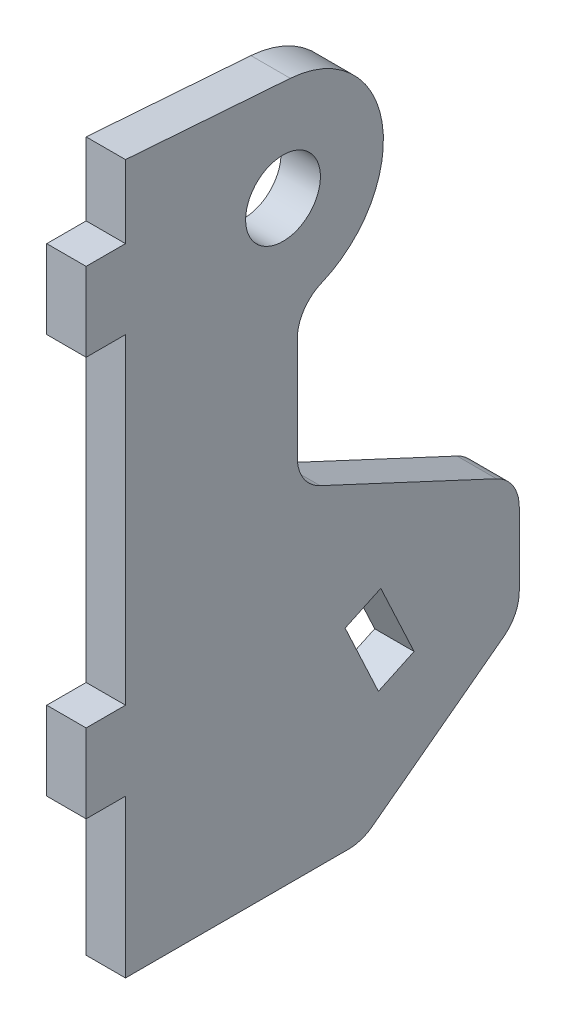
ISO-10303-21;
HEADER;
FILE_DESCRIPTION(('STEP AP214'),'2;1');
FILE_NAME('part.step','',(''),(''),'','','');
FILE_SCHEMA(('AUTOMOTIVE_DESIGN { 1 0 10303 214 1 1 1 1 }'));
ENDSEC;
DATA;
#1=APPLICATION_CONTEXT('core data for automotive mechanical design processes');
#2=APPLICATION_PROTOCOL_DEFINITION('international standard','automotive_design',2000,#1);
#3=PRODUCT_CONTEXT('',#1,'mechanical');
#4=PRODUCT('Part','Part','',(#3));
#5=PRODUCT_RELATED_PRODUCT_CATEGORY('part','',(#4));
#6=PRODUCT_DEFINITION_FORMATION('','',#4);
#7=PRODUCT_DEFINITION_CONTEXT('part definition',#1,'design');
#8=PRODUCT_DEFINITION('design','',#6,#7);
#9=PRODUCT_DEFINITION_SHAPE('','',#8);
#10=(LENGTH_UNIT() NAMED_UNIT(*) SI_UNIT(.MILLI.,.METRE.));
#11=(NAMED_UNIT(*) PLANE_ANGLE_UNIT() SI_UNIT($,.RADIAN.));
#12=(NAMED_UNIT(*) SI_UNIT($,.STERADIAN.) SOLID_ANGLE_UNIT());
#13=UNCERTAINTY_MEASURE_WITH_UNIT(LENGTH_MEASURE(1.E-05),#10,'distance_accuracy_value','');
#14=(GEOMETRIC_REPRESENTATION_CONTEXT(3) GLOBAL_UNCERTAINTY_ASSIGNED_CONTEXT((#13)) GLOBAL_UNIT_ASSIGNED_CONTEXT((#10,
#11,#12)) REPRESENTATION_CONTEXT('',''));
#15=CARTESIAN_POINT('',(0.,0.,0.));
#16=DIRECTION('',(0.,0.,1.));
#17=DIRECTION('',(1.,0.,0.));
#18=AXIS2_PLACEMENT_3D('',#15,#16,#17);
#19=CARTESIAN_POINT('',(2.5,-15.7577175116872,0.));
#20=DIRECTION('',(0.,0.,-1.));
#21=DIRECTION('',(1.,0.,0.));
#22=AXIS2_PLACEMENT_3D('',#19,#20,#21);
#23=PLANE('',#22);
#24=DIRECTION('',(-1.,0.,0.));
#25=VECTOR('',#24,1.);
#26=CARTESIAN_POINT('',(0.,-55.7577175116872,0.));
#27=LINE('',#26,#25);
#28=CARTESIAN_POINT('',(2.5,-55.7577175116872,0.));
#29=VERTEX_POINT('',#28);
#30=CARTESIAN_POINT('',(-2.5,-55.7577175116872,0.));
#31=VERTEX_POINT('',#30);
#32=EDGE_CURVE('E224',#29,#31,#27,.T.);
#33=ORIENTED_EDGE('',*,*,#32,.T.);
#34=DIRECTION('',(0.,1.,0.));
#35=VECTOR('',#34,1.);
#36=CARTESIAN_POINT('',(-2.5,-15.7577175116872,0.));
#37=LINE('',#36,#35);
#38=CARTESIAN_POINT('',(-2.5,-75.7577175116872,0.));
#39=VERTEX_POINT('',#38);
#40=EDGE_CURVE('E337',#39,#31,#37,.T.);
#41=ORIENTED_EDGE('',*,*,#40,.F.);
#42=DIRECTION('',(-1.,0.,0.));
#43=VECTOR('',#42,1.);
#44=CARTESIAN_POINT('',(2.5,-75.7577175116872,0.));
#45=LINE('',#44,#43);
#46=CARTESIAN_POINT('',(2.5,-75.7577175116872,0.));
#47=VERTEX_POINT('',#46);
#48=EDGE_CURVE('E355',#47,#39,#45,.T.);
#49=ORIENTED_EDGE('',*,*,#48,.F.);
#50=DIRECTION('',(0.,1.,0.));
#51=VECTOR('',#50,1.);
#52=CARTESIAN_POINT('',(2.5,-75.7577175116872,0.));
#53=LINE('',#52,#51);
#54=EDGE_CURVE('E302',#47,#29,#53,.T.);
#55=ORIENTED_EDGE('',*,*,#54,.T.);
#56=EDGE_LOOP('',(#33,#41,#49,#55));
#57=FACE_BOUND('',#56,.T.);
#58=ADVANCED_FACE('F43',(#57),#23,.F.);
#59=CARTESIAN_POINT('',(2.5,0.,-20.));
#60=DIRECTION('',(1.,0.,0.));
#61=DIRECTION('',(0.,0.,1.));
#62=AXIS2_PLACEMENT_3D('',#59,#60,#61);
#63=PLANE('',#62);
#64=DIRECTION('',(0.,0.4226182617407,-0.90630778703665));
#65=VECTOR('',#64,1.);
#66=CARTESIAN_POINT('',(2.5,-51.2261785765039,-27.8869086912965));
#67=LINE('',#66,#65);
#68=CARTESIAN_POINT('',(2.5,-51.2261785765039,-27.8869086912965));
#69=VERTEX_POINT('',#68);
#70=CARTESIAN_POINT('',(2.5,-49.1130872678004,-32.4184476264797));
#71=VERTEX_POINT('',#70);
#72=EDGE_CURVE('E248',#69,#71,#67,.T.);
#73=ORIENTED_EDGE('',*,*,#72,.T.);
#74=DIRECTION('',(0.,-0.90630778703665,-0.422618261740701));
#75=VECTOR('',#74,1.);
#76=CARTESIAN_POINT('',(2.5,-49.1130872678004,-32.4184476264797));
#77=LINE('',#76,#75);
#78=CARTESIAN_POINT('',(2.5,-58.1761651381669,-36.6446302438868));
#79=VERTEX_POINT('',#78);
#80=EDGE_CURVE('E251',#71,#79,#77,.T.);
#81=ORIENTED_EDGE('',*,*,#80,.T.);
#82=DIRECTION('',(0.,0.422618261740699,-0.90630778703665));
#83=VECTOR('',#82,1.);
#84=CARTESIAN_POINT('',(2.5,-60.2892564468704,-32.1130913087035));
#85=LINE('',#84,#83);
#86=CARTESIAN_POINT('',(2.5,-60.2892564468704,-32.1130913087035));
#87=VERTEX_POINT('',#86);
#88=EDGE_CURVE('E254',#87,#79,#85,.T.);
#89=ORIENTED_EDGE('',*,*,#88,.F.);
#90=DIRECTION('',(0.,-0.90630778703665,-0.4226182617407));
#91=VECTOR('',#90,1.);
#92=CARTESIAN_POINT('',(2.5,-51.2261785765039,-27.8869086912965));
#93=LINE('',#92,#91);
#94=EDGE_CURVE('E257',#69,#87,#93,.T.);
#95=ORIENTED_EDGE('',*,*,#94,.F.);
#96=EDGE_LOOP('',(#73,#81,#89,#95));
#97=FACE_BOUND('',#96,.T.);
#98=DIRECTION('',(0.,-0.6,0.8));
#99=VECTOR('',#98,1.);
#100=CARTESIAN_POINT('',(2.5,-75.7577175116872,-30.));
#101=LINE('',#100,#99);
#102=CARTESIAN_POINT('',(2.5,-62.2577175116872,-48.));
#103=VERTEX_POINT('',#102);
#104=CARTESIAN_POINT('',(2.5,-74.7577175116872,-31.3333333333333));
#105=VERTEX_POINT('',#104);
#106=EDGE_CURVE('E297',#103,#105,#101,.T.);
#107=ORIENTED_EDGE('',*,*,#106,.F.);
#108=CARTESIAN_POINT('',(2.5,-58.2577175116872,-45.));
#109=DIRECTION('',(-1.,0.,0.));
#110=DIRECTION('',(0.,0.,1.));
#111=AXIS2_PLACEMENT_3D('',#108,#109,#110);
#112=CIRCLE('',#111,5.);
#113=CARTESIAN_POINT('',(2.5,-58.2577175116872,-50.));
#114=VERTEX_POINT('',#113);
#115=EDGE_CURVE('E390',#114,#103,#112,.T.);
#116=ORIENTED_EDGE('',*,*,#115,.F.);
#117=DIRECTION('',(0.,-1.,0.));
#118=VECTOR('',#117,1.);
#119=CARTESIAN_POINT('',(2.5,-60.7577175116872,-50.));
#120=LINE('',#119,#118);
#121=CARTESIAN_POINT('',(2.5,-48.9436070290023,-50.));
#122=VERTEX_POINT('',#121);
#123=EDGE_CURVE('E294',#122,#114,#120,.T.);
#124=ORIENTED_EDGE('',*,*,#123,.F.);
#125=CARTESIAN_POINT('',(2.5,-48.9436070290023,-45.));
#126=DIRECTION('',(-1.,0.,0.));
#127=DIRECTION('',(0.,0.,1.));
#128=AXIS2_PLACEMENT_3D('',#125,#126,#127);
#129=CIRCLE('',#128,5.);
#130=CARTESIAN_POINT('',(2.5,-44.4117445757462,-47.1123973832516));
#131=VERTEX_POINT('',#130);
#132=EDGE_CURVE('E387',#131,#122,#129,.T.);
#133=ORIENTED_EDGE('',*,*,#132,.F.);
#134=DIRECTION('',(0.,-0.42247947665031,-0.906372490651211));
#135=VECTOR('',#134,1.);
#136=CARTESIAN_POINT('',(2.5,-45.7577175116872,-50.));
#137=LINE('',#136,#135);
#138=CARTESIAN_POINT('',(2.5,-33.9661115133212,-24.7027065497836));
#139=VERTEX_POINT('',#138);
#140=EDGE_CURVE('E291',#139,#131,#137,.T.);
#141=ORIENTED_EDGE('',*,*,#140,.F.);
#142=CARTESIAN_POINT('',(2.5,-29.4342490600651,-26.8151039330352));
#143=DIRECTION('',(-1.,0.,0.));
#144=DIRECTION('',(0.,0.,1.));
#145=AXIS2_PLACEMENT_3D('',#142,#143,#144);
#146=CIRCLE('',#145,5.);
#147=CARTESIAN_POINT('',(2.5,-29.4342490600651,-21.8151039330352));
#148=VERTEX_POINT('',#147);
#149=EDGE_CURVE('E11',#148,#139,#146,.F.);
#150=ORIENTED_EDGE('',*,*,#149,.F.);
#151=DIRECTION('',(0.,-1.,0.));
#152=VECTOR('',#151,1.);
#153=CARTESIAN_POINT('',(2.5,-32.6201385773802,-21.8151039330352));
#154=LINE('',#153,#152);
#155=CARTESIAN_POINT('',(2.5,-16.3895350264103,-21.8151039330352));
#156=VERTEX_POINT('',#155);
#157=EDGE_CURVE('E288',#156,#148,#154,.T.);
#158=ORIENTED_EDGE('',*,*,#157,.F.);
#159=CARTESIAN_POINT('',(2.5,-16.3895350264103,-26.8151039330352));
#160=DIRECTION('',(-1.,0.,0.));
#161=DIRECTION('',(0.,0.,1.));
#162=AXIS2_PLACEMENT_3D('',#159,#160,#161);
#163=CIRCLE('',#162,5.);
#164=CARTESIAN_POINT('',(2.5,-11.7727645964355,-24.8953563462647));
#165=VERTEX_POINT('',#164);
#166=EDGE_CURVE('E403',#165,#156,#163,.F.);
#167=ORIENTED_EDGE('',*,*,#166,.F.);
#168=CARTESIAN_POINT('',(2.5,0.,-20.));
#169=DIRECTION('',(-1.,0.,0.));
#170=DIRECTION('',(0.,0.,1.));
#171=AXIS2_PLACEMENT_3D('',#168,#169,#170);
#172=CIRCLE('',#171,12.75);
#173=CARTESIAN_POINT('',(2.5,12.7162353337246,-20.9272857905385));
#174=VERTEX_POINT('',#173);
#175=EDGE_CURVE('E285',#174,#165,#172,.T.);
#176=ORIENTED_EDGE('',*,*,#175,.F.);
#177=DIRECTION('',(0.,-0.0727282972971378,-0.997351790880359));
#178=VECTOR('',#177,1.);
#179=CARTESIAN_POINT('',(2.5,14.2422824883128,0.));
#180=LINE('',#179,#178);
#181=CARTESIAN_POINT('',(2.5,14.2422824883128,0.));
#182=VERTEX_POINT('',#181);
#183=EDGE_CURVE('E281',#182,#174,#180,.T.);
#184=ORIENTED_EDGE('',*,*,#183,.F.);
#185=DIRECTION('',(0.,1.,0.));
#186=VECTOR('',#185,1.);
#187=CARTESIAN_POINT('',(2.5,5.,0.));
#188=LINE('',#187,#186);
#189=CARTESIAN_POINT('',(2.5,5.,0.));
#190=VERTEX_POINT('',#189);
#191=EDGE_CURVE('E278',#190,#182,#188,.T.);
#192=ORIENTED_EDGE('',*,*,#191,.F.);
#193=DIRECTION('',(0.,0.,-1.));
#194=VECTOR('',#193,1.);
#195=CARTESIAN_POINT('',(2.5,5.,5.));
#196=LINE('',#195,#194);
#197=CARTESIAN_POINT('',(2.5,5.,5.));
#198=VERTEX_POINT('',#197);
#199=EDGE_CURVE('E310',#198,#190,#196,.T.);
#200=ORIENTED_EDGE('',*,*,#199,.F.);
#201=DIRECTION('',(0.,1.,0.));
#202=VECTOR('',#201,1.);
#203=CARTESIAN_POINT('',(2.5,5.,5.));
#204=LINE('',#203,#202);
#205=CARTESIAN_POINT('',(2.5,-5.,5.));
#206=VERTEX_POINT('',#205);
#207=EDGE_CURVE('E307',#206,#198,#204,.T.);
#208=ORIENTED_EDGE('',*,*,#207,.F.);
#209=DIRECTION('',(0.,0.,1.));
#210=VECTOR('',#209,1.);
#211=CARTESIAN_POINT('',(2.5,-5.,5.));
#212=LINE('',#211,#210);
#213=CARTESIAN_POINT('',(2.5,-5.,0.));
#214=VERTEX_POINT('',#213);
#215=EDGE_CURVE('E304',#214,#206,#212,.T.);
#216=ORIENTED_EDGE('',*,*,#215,.F.);
#217=CARTESIAN_POINT('',(2.5,-45.7577175116872,0.));
#218=VERTEX_POINT('',#217);
#219=EDGE_CURVE('E233',#218,#214,#53,.T.);
#220=ORIENTED_EDGE('',*,*,#219,.F.);
#221=DIRECTION('',(0.,0.,-1.));
#222=VECTOR('',#221,1.);
#223=CARTESIAN_POINT('',(2.5,-45.7577175116872,5.));
#224=LINE('',#223,#222);
#225=CARTESIAN_POINT('',(2.5,-45.7577175116872,5.));
#226=VERTEX_POINT('',#225);
#227=EDGE_CURVE('E216',#226,#218,#224,.T.);
#228=ORIENTED_EDGE('',*,*,#227,.F.);
#229=DIRECTION('',(0.,-1.,0.));
#230=VECTOR('',#229,1.);
#231=CARTESIAN_POINT('',(2.5,0.,5.));
#232=LINE('',#231,#230);
#233=CARTESIAN_POINT('',(2.5,-55.7577175116872,5.));
#234=VERTEX_POINT('',#233);
#235=EDGE_CURVE('E223',#226,#234,#232,.T.);
#236=ORIENTED_EDGE('',*,*,#235,.T.);
#237=DIRECTION('',(0.,0.,-1.));
#238=VECTOR('',#237,1.);
#239=CARTESIAN_POINT('',(2.5,-55.7577175116872,5.));
#240=LINE('',#239,#238);
#241=EDGE_CURVE('E66',#234,#29,#240,.T.);
#242=ORIENTED_EDGE('',*,*,#241,.T.);
#243=ORIENTED_EDGE('',*,*,#54,.F.);
#244=DIRECTION('',(0.,0.,1.));
#245=VECTOR('',#244,1.);
#246=CARTESIAN_POINT('',(2.5,-75.7577175116872,-30.));
#247=LINE('',#246,#245);
#248=CARTESIAN_POINT('',(2.5,-75.7577175116872,-28.3333333333333));
#249=VERTEX_POINT('',#248);
#250=EDGE_CURVE('E300',#249,#47,#247,.T.);
#251=ORIENTED_EDGE('',*,*,#250,.F.);
#252=CARTESIAN_POINT('',(2.5,-70.7577175116872,-28.3333333333333));
#253=DIRECTION('',(-1.,0.,0.));
#254=DIRECTION('',(0.,0.,1.));
#255=AXIS2_PLACEMENT_3D('',#252,#253,#254);
#256=CIRCLE('',#255,5.);
#257=EDGE_CURVE('E393',#105,#249,#256,.T.);
#258=ORIENTED_EDGE('',*,*,#257,.F.);
#259=EDGE_LOOP('',(#107,#116,#124,#133,#141,#150,#158,#167,#176,#184,#192,#200,#208,#216,#220,
#228,#236,#242,#243,#251,#258));
#260=FACE_BOUND('',#259,.T.);
#261=CARTESIAN_POINT('',(2.5,0.,-20.));
#262=DIRECTION('',(-1.,0.,0.));
#263=DIRECTION('',(0.,0.,1.));
#264=AXIS2_PLACEMENT_3D('',#261,#262,#263);
#265=CIRCLE('',#264,4.75);
#266=CARTESIAN_POINT('',(2.5,0.,-15.25));
#267=VERTEX_POINT('',#266);
#268=EDGE_CURVE('E272',#267,#267,#265,.T.);
#269=ORIENTED_EDGE('',*,*,#268,.T.);
#270=EDGE_LOOP('',(#269));
#271=FACE_BOUND('',#270,.T.);
#272=ADVANCED_FACE('F230',(#97,#260,#271),#63,.T.);
#273=CARTESIAN_POINT('',(-2.5,0.,-20.));
#274=DIRECTION('',(1.,0.,0.));
#275=DIRECTION('',(0.,0.,1.));
#276=AXIS2_PLACEMENT_3D('',#273,#274,#275);
#277=PLANE('',#276);
#278=DIRECTION('',(0.,0.90630778703665,0.4226182617407));
#279=VECTOR('',#278,1.);
#280=CARTESIAN_POINT('',(-2.5,-51.2261785765039,-27.8869086912965));
#281=LINE('',#280,#279);
#282=CARTESIAN_POINT('',(-2.5,-60.2892564468704,-32.1130913087035));
#283=VERTEX_POINT('',#282);
#284=CARTESIAN_POINT('',(-2.5,-51.2261785765039,-27.8869086912965));
#285=VERTEX_POINT('',#284);
#286=EDGE_CURVE('E237',#283,#285,#281,.T.);
#287=ORIENTED_EDGE('',*,*,#286,.F.);
#288=DIRECTION('',(0.,-0.422618261740699,0.90630778703665));
#289=VECTOR('',#288,1.);
#290=CARTESIAN_POINT('',(-2.5,-60.2892564468704,-32.1130913087035));
#291=LINE('',#290,#289);
#292=CARTESIAN_POINT('',(-2.5,-58.1761651381669,-36.6446302438868));
#293=VERTEX_POINT('',#292);
#294=EDGE_CURVE('E234',#293,#283,#291,.T.);
#295=ORIENTED_EDGE('',*,*,#294,.F.);
#296=DIRECTION('',(0.,0.90630778703665,0.422618261740701));
#297=VECTOR('',#296,1.);
#298=CARTESIAN_POINT('',(-2.5,-49.1130872678004,-32.4184476264797));
#299=LINE('',#298,#297);
#300=CARTESIAN_POINT('',(-2.5,-49.1130872678004,-32.4184476264797));
#301=VERTEX_POINT('',#300);
#302=EDGE_CURVE('E263',#293,#301,#299,.T.);
#303=ORIENTED_EDGE('',*,*,#302,.T.);
#304=DIRECTION('',(0.,-0.4226182617407,0.90630778703665));
#305=VECTOR('',#304,1.);
#306=CARTESIAN_POINT('',(-2.5,-51.2261785765039,-27.8869086912965));
#307=LINE('',#306,#305);
#308=EDGE_CURVE('E245',#301,#285,#307,.T.);
#309=ORIENTED_EDGE('',*,*,#308,.T.);
#310=EDGE_LOOP('',(#287,#295,#303,#309));
#311=FACE_BOUND('',#310,.T.);
#312=DIRECTION('',(0.,0.,1.));
#313=VECTOR('',#312,1.);
#314=CARTESIAN_POINT('',(-2.5,-75.7577175116872,-30.));
#315=LINE('',#314,#313);
#316=CARTESIAN_POINT('',(-2.5,-75.7577175116872,-28.3333333333333));
#317=VERTEX_POINT('',#316);
#318=EDGE_CURVE('E334',#317,#39,#315,.T.);
#319=ORIENTED_EDGE('',*,*,#318,.T.);
#320=ORIENTED_EDGE('',*,*,#40,.T.);
#321=DIRECTION('',(0.,0.,-1.));
#322=VECTOR('',#321,1.);
#323=CARTESIAN_POINT('',(-2.5,-55.7577175116872,5.));
#324=LINE('',#323,#322);
#325=CARTESIAN_POINT('',(-2.5,-55.7577175116872,5.));
#326=VERTEX_POINT('',#325);
#327=EDGE_CURVE('E239',#326,#31,#324,.T.);
#328=ORIENTED_EDGE('',*,*,#327,.F.);
#329=DIRECTION('',(0.,1.,0.));
#330=VECTOR('',#329,1.);
#331=CARTESIAN_POINT('',(-2.5,0.,5.));
#332=LINE('',#331,#330);
#333=CARTESIAN_POINT('',(-2.5,-45.7577175116872,5.));
#334=VERTEX_POINT('',#333);
#335=EDGE_CURVE('E456',#326,#334,#332,.T.);
#336=ORIENTED_EDGE('',*,*,#335,.T.);
#337=DIRECTION('',(0.,0.,-1.));
#338=VECTOR('',#337,1.);
#339=CARTESIAN_POINT('',(-2.5,-45.7577175116872,5.));
#340=LINE('',#339,#338);
#341=CARTESIAN_POINT('',(-2.5,-45.7577175116872,0.));
#342=VERTEX_POINT('',#341);
#343=EDGE_CURVE('E219',#334,#342,#340,.T.);
#344=ORIENTED_EDGE('',*,*,#343,.T.);
#345=CARTESIAN_POINT('',(-2.5,-5.,0.));
#346=VERTEX_POINT('',#345);
#347=EDGE_CURVE('E336',#342,#346,#37,.T.);
#348=ORIENTED_EDGE('',*,*,#347,.T.);
#349=DIRECTION('',(0.,0.,1.));
#350=VECTOR('',#349,1.);
#351=CARTESIAN_POINT('',(-2.5,-5.,5.));
#352=LINE('',#351,#350);
#353=CARTESIAN_POINT('',(-2.5,-5.,5.));
#354=VERTEX_POINT('',#353);
#355=EDGE_CURVE('E340',#346,#354,#352,.T.);
#356=ORIENTED_EDGE('',*,*,#355,.T.);
#357=DIRECTION('',(0.,1.,0.));
#358=VECTOR('',#357,1.);
#359=CARTESIAN_POINT('',(-2.5,5.,5.));
#360=LINE('',#359,#358);
#361=CARTESIAN_POINT('',(-2.5,5.,5.));
#362=VERTEX_POINT('',#361);
#363=EDGE_CURVE('E343',#354,#362,#360,.T.);
#364=ORIENTED_EDGE('',*,*,#363,.T.);
#365=DIRECTION('',(0.,0.,-1.));
#366=VECTOR('',#365,1.);
#367=CARTESIAN_POINT('',(-2.5,5.,5.));
#368=LINE('',#367,#366);
#369=CARTESIAN_POINT('',(-2.5,5.,0.));
#370=VERTEX_POINT('',#369);
#371=EDGE_CURVE('E282',#362,#370,#368,.T.);
#372=ORIENTED_EDGE('',*,*,#371,.T.);
#373=DIRECTION('',(0.,1.,0.));
#374=VECTOR('',#373,1.);
#375=CARTESIAN_POINT('',(-2.5,5.,0.));
#376=LINE('',#375,#374);
#377=CARTESIAN_POINT('',(-2.5,14.2422824883128,0.));
#378=VERTEX_POINT('',#377);
#379=EDGE_CURVE('E275',#370,#378,#376,.T.);
#380=ORIENTED_EDGE('',*,*,#379,.T.);
#381=DIRECTION('',(0.,-0.0727282972971378,-0.997351790880359));
#382=VECTOR('',#381,1.);
#383=CARTESIAN_POINT('',(-2.5,14.2422824883128,0.));
#384=LINE('',#383,#382);
#385=CARTESIAN_POINT('',(-2.5,12.7162353337246,-20.9272857905385));
#386=VERTEX_POINT('',#385);
#387=EDGE_CURVE('E316',#378,#386,#384,.T.);
#388=ORIENTED_EDGE('',*,*,#387,.T.);
#389=CARTESIAN_POINT('',(-2.5,0.,-20.));
#390=DIRECTION('',(-1.,0.,0.));
#391=DIRECTION('',(0.,0.,1.));
#392=AXIS2_PLACEMENT_3D('',#389,#390,#391);
#393=CIRCLE('',#392,12.75);
#394=CARTESIAN_POINT('',(-2.5,-11.7727645964355,-24.8953563462647));
#395=VERTEX_POINT('',#394);
#396=EDGE_CURVE('E319',#386,#395,#393,.T.);
#397=ORIENTED_EDGE('',*,*,#396,.T.);
#398=CARTESIAN_POINT('',(-2.5,-16.3895350264103,-26.8151039330352));
#399=DIRECTION('',(-1.,0.,0.));
#400=DIRECTION('',(0.,0.,1.));
#401=AXIS2_PLACEMENT_3D('',#398,#399,#400);
#402=CIRCLE('',#401,5.);
#403=CARTESIAN_POINT('',(-2.5,-16.3895350264103,-21.8151039330352));
#404=VERTEX_POINT('',#403);
#405=EDGE_CURVE('E400',#404,#395,#402,.T.);
#406=ORIENTED_EDGE('',*,*,#405,.F.);
#407=DIRECTION('',(0.,-1.,0.));
#408=VECTOR('',#407,1.);
#409=CARTESIAN_POINT('',(-2.5,-32.6201385773802,-21.8151039330352));
#410=LINE('',#409,#408);
#411=CARTESIAN_POINT('',(-2.5,-29.4342490600651,-21.8151039330352));
#412=VERTEX_POINT('',#411);
#413=EDGE_CURVE('E322',#404,#412,#410,.T.);
#414=ORIENTED_EDGE('',*,*,#413,.T.);
#415=CARTESIAN_POINT('',(-2.5,-29.4342490600651,-26.8151039330352));
#416=DIRECTION('',(-1.,0.,0.));
#417=DIRECTION('',(0.,0.,1.));
#418=AXIS2_PLACEMENT_3D('',#415,#416,#417);
#419=CIRCLE('',#418,5.);
#420=CARTESIAN_POINT('',(-2.5,-33.9661115133212,-24.7027065497836));
#421=VERTEX_POINT('',#420);
#422=EDGE_CURVE('E51',#421,#412,#419,.T.);
#423=ORIENTED_EDGE('',*,*,#422,.F.);
#424=DIRECTION('',(0.,-0.42247947665031,-0.906372490651211));
#425=VECTOR('',#424,1.);
#426=CARTESIAN_POINT('',(-2.5,-45.7577175116872,-50.));
#427=LINE('',#426,#425);
#428=CARTESIAN_POINT('',(-2.5,-44.4117445757462,-47.1123973832516));
#429=VERTEX_POINT('',#428);
#430=EDGE_CURVE('E325',#421,#429,#427,.T.);
#431=ORIENTED_EDGE('',*,*,#430,.T.);
#432=CARTESIAN_POINT('',(-2.5,-48.9436070290023,-45.));
#433=DIRECTION('',(-1.,0.,0.));
#434=DIRECTION('',(0.,0.,1.));
#435=AXIS2_PLACEMENT_3D('',#432,#433,#434);
#436=CIRCLE('',#435,5.);
#437=CARTESIAN_POINT('',(-2.5,-48.9436070290023,-50.));
#438=VERTEX_POINT('',#437);
#439=EDGE_CURVE('E374',#438,#429,#436,.F.);
#440=ORIENTED_EDGE('',*,*,#439,.F.);
#441=DIRECTION('',(0.,-1.,0.));
#442=VECTOR('',#441,1.);
#443=CARTESIAN_POINT('',(-2.5,-60.7577175116872,-50.));
#444=LINE('',#443,#442);
#445=CARTESIAN_POINT('',(-2.5,-58.2577175116872,-50.));
#446=VERTEX_POINT('',#445);
#447=EDGE_CURVE('E328',#438,#446,#444,.T.);
#448=ORIENTED_EDGE('',*,*,#447,.T.);
#449=CARTESIAN_POINT('',(-2.5,-58.2577175116872,-45.));
#450=DIRECTION('',(-1.,0.,0.));
#451=DIRECTION('',(0.,0.,1.));
#452=AXIS2_PLACEMENT_3D('',#449,#450,#451);
#453=CIRCLE('',#452,5.);
#454=CARTESIAN_POINT('',(-2.5,-62.2577175116872,-48.));
#455=VERTEX_POINT('',#454);
#456=EDGE_CURVE('E377',#455,#446,#453,.F.);
#457=ORIENTED_EDGE('',*,*,#456,.F.);
#458=DIRECTION('',(0.,-0.6,0.8));
#459=VECTOR('',#458,1.);
#460=CARTESIAN_POINT('',(-2.5,-75.7577175116872,-30.));
#461=LINE('',#460,#459);
#462=CARTESIAN_POINT('',(-2.5,-74.7577175116872,-31.3333333333333));
#463=VERTEX_POINT('',#462);
#464=EDGE_CURVE('E331',#455,#463,#461,.T.);
#465=ORIENTED_EDGE('',*,*,#464,.T.);
#466=CARTESIAN_POINT('',(-2.5,-70.7577175116872,-28.3333333333333));
#467=DIRECTION('',(-1.,0.,0.));
#468=DIRECTION('',(0.,0.,1.));
#469=AXIS2_PLACEMENT_3D('',#466,#467,#468);
#470=CIRCLE('',#469,5.);
#471=EDGE_CURVE('E380',#317,#463,#470,.F.);
#472=ORIENTED_EDGE('',*,*,#471,.F.);
#473=EDGE_LOOP('',(#319,#320,#328,#336,#344,#348,#356,#364,#372,#380,#388,#397,#406,#414,#423,
#431,#440,#448,#457,#465,#472));
#474=FACE_BOUND('',#473,.T.);
#475=CARTESIAN_POINT('',(-2.5,0.,-20.));
#476=DIRECTION('',(-1.,0.,0.));
#477=DIRECTION('',(0.,0.,1.));
#478=AXIS2_PLACEMENT_3D('',#475,#476,#477);
#479=CIRCLE('',#478,4.75);
#480=CARTESIAN_POINT('',(-2.5,0.,-15.25));
#481=VERTEX_POINT('',#480);
#482=EDGE_CURVE('E271',#481,#481,#479,.T.);
#483=ORIENTED_EDGE('',*,*,#482,.F.);
#484=EDGE_LOOP('',(#483));
#485=FACE_BOUND('',#484,.T.);
#486=ADVANCED_FACE('F413',(#311,#474,#485),#277,.F.);
#487=CARTESIAN_POINT('',(2.5,5.,0.));
#488=DIRECTION('',(0.,0.,-1.));
#489=DIRECTION('',(1.,0.,0.));
#490=AXIS2_PLACEMENT_3D('',#487,#488,#489);
#491=PLANE('',#490);
#492=ORIENTED_EDGE('',*,*,#379,.F.);
#493=DIRECTION('',(-1.,0.,0.));
#494=VECTOR('',#493,1.);
#495=CARTESIAN_POINT('',(2.5,5.,0.));
#496=LINE('',#495,#494);
#497=EDGE_CURVE('E313',#190,#370,#496,.T.);
#498=ORIENTED_EDGE('',*,*,#497,.F.);
#499=ORIENTED_EDGE('',*,*,#191,.T.);
#500=DIRECTION('',(-1.,0.,0.));
#501=VECTOR('',#500,1.);
#502=CARTESIAN_POINT('',(2.5,14.2422824883128,0.));
#503=LINE('',#502,#501);
#504=EDGE_CURVE('E360',#182,#378,#503,.T.);
#505=ORIENTED_EDGE('',*,*,#504,.T.);
#506=EDGE_LOOP('',(#492,#498,#499,#505));
#507=FACE_BOUND('',#506,.T.);
#508=ADVANCED_FACE('F475',(#507),#491,.F.);
#509=CARTESIAN_POINT('',(2.5,14.2422824883128,0.));
#510=DIRECTION('',(0.,-0.997351790880359,0.0727282972971378));
#511=DIRECTION('',(0.,0.0727282972971378,0.997351790880359));
#512=AXIS2_PLACEMENT_3D('',#509,#510,#511);
#513=PLANE('',#512);
#514=ORIENTED_EDGE('',*,*,#387,.F.);
#515=ORIENTED_EDGE('',*,*,#504,.F.);
#516=ORIENTED_EDGE('',*,*,#183,.T.);
#517=DIRECTION('',(-1.,0.,0.));
#518=VECTOR('',#517,1.);
#519=CARTESIAN_POINT('',(2.5,12.7162353337246,-20.9272857905385));
#520=LINE('',#519,#518);
#521=EDGE_CURVE('E358',#174,#386,#520,.T.);
#522=ORIENTED_EDGE('',*,*,#521,.T.);
#523=EDGE_LOOP('',(#514,#515,#516,#522));
#524=FACE_BOUND('',#523,.T.);
#525=ADVANCED_FACE('F479',(#524),#513,.F.);
#526=CARTESIAN_POINT('',(2.5,0.,-20.));
#527=DIRECTION('',(-1.,0.,0.));
#528=DIRECTION('',(0.,0.,-1.));
#529=AXIS2_PLACEMENT_3D('',#526,#527,#528);
#530=CYLINDRICAL_SURFACE('',#529,12.75);
#531=ORIENTED_EDGE('',*,*,#396,.F.);
#532=ORIENTED_EDGE('',*,*,#521,.F.);
#533=ORIENTED_EDGE('',*,*,#175,.T.);
#534=DIRECTION('',(-1.,0.,0.));
#535=VECTOR('',#534,1.);
#536=CARTESIAN_POINT('',(2.5,-11.7727645964355,-24.8953563462647));
#537=LINE('',#536,#535);
#538=EDGE_CURVE('E366',#395,#165,#537,.F.);
#539=ORIENTED_EDGE('',*,*,#538,.F.);
#540=EDGE_LOOP('',(#531,#532,#533,#539));
#541=FACE_BOUND('',#540,.T.);
#542=ADVANCED_FACE('F482',(#541),#530,.T.);
#543=CARTESIAN_POINT('',(2.5,-32.6201385773802,-21.8151039330352));
#544=DIRECTION('',(0.,0.,1.));
#545=DIRECTION('',(-1.,0.,0.));
#546=AXIS2_PLACEMENT_3D('',#543,#544,#545);
#547=PLANE('',#546);
#548=ORIENTED_EDGE('',*,*,#157,.T.);
#549=DIRECTION('',(-1.,0.,0.));
#550=VECTOR('',#549,1.);
#551=CARTESIAN_POINT('',(2.5,-29.4342490600651,-21.8151039330352));
#552=LINE('',#551,#550);
#553=EDGE_CURVE('E362',#412,#148,#552,.F.);
#554=ORIENTED_EDGE('',*,*,#553,.F.);
#555=ORIENTED_EDGE('',*,*,#413,.F.);
#556=DIRECTION('',(1.,0.,0.));
#557=VECTOR('',#556,1.);
#558=CARTESIAN_POINT('',(-2.5,-16.3895350264103,-21.8151039330352));
#559=LINE('',#558,#557);
#560=EDGE_CURVE('E364',#156,#404,#559,.F.);
#561=ORIENTED_EDGE('',*,*,#560,.F.);
#562=EDGE_LOOP('',(#548,#554,#555,#561));
#563=FACE_BOUND('',#562,.T.);
#564=ADVANCED_FACE('F416',(#563),#547,.F.);
#565=CARTESIAN_POINT('',(2.5,-45.7577175116872,-50.));
#566=DIRECTION('',(0.,-0.906372490651211,0.42247947665031));
#567=DIRECTION('',(0.,0.42247947665031,0.906372490651211));
#568=AXIS2_PLACEMENT_3D('',#565,#566,#567);
#569=PLANE('',#568);
#570=ORIENTED_EDGE('',*,*,#140,.T.);
#571=DIRECTION('',(-1.,0.,0.));
#572=VECTOR('',#571,1.);
#573=CARTESIAN_POINT('',(2.5,-44.4117445757462,-47.1123973832516));
#574=LINE('',#573,#572);
#575=EDGE_CURVE('E368',#429,#131,#574,.F.);
#576=ORIENTED_EDGE('',*,*,#575,.F.);
#577=ORIENTED_EDGE('',*,*,#430,.F.);
#578=DIRECTION('',(-1.,0.,0.));
#579=VECTOR('',#578,1.);
#580=CARTESIAN_POINT('',(-2.5,-33.9661115133212,-24.7027065497836));
#581=LINE('',#580,#579);
#582=EDGE_CURVE('E370',#139,#421,#581,.T.);
#583=ORIENTED_EDGE('',*,*,#582,.F.);
#584=EDGE_LOOP('',(#570,#576,#577,#583));
#585=FACE_BOUND('',#584,.T.);
#586=ADVANCED_FACE('F424',(#585),#569,.F.);
#587=CARTESIAN_POINT('',(2.5,-60.7577175116872,-50.));
#588=DIRECTION('',(0.,0.,1.));
#589=DIRECTION('',(-1.,0.,0.));
#590=AXIS2_PLACEMENT_3D('',#587,#588,#589);
#591=PLANE('',#590);
#592=ORIENTED_EDGE('',*,*,#447,.F.);
#593=DIRECTION('',(-1.,0.,0.));
#594=VECTOR('',#593,1.);
#595=CARTESIAN_POINT('',(2.5,-48.9436070290023,-50.));
#596=LINE('',#595,#594);
#597=EDGE_CURVE('E396',#122,#438,#596,.T.);
#598=ORIENTED_EDGE('',*,*,#597,.F.);
#599=ORIENTED_EDGE('',*,*,#123,.T.);
#600=DIRECTION('',(-1.,0.,0.));
#601=VECTOR('',#600,1.);
#602=CARTESIAN_POINT('',(2.5,-58.2577175116872,-50.));
#603=LINE('',#602,#601);
#604=EDGE_CURVE('E398',#446,#114,#603,.F.);
#605=ORIENTED_EDGE('',*,*,#604,.F.);
#606=EDGE_LOOP('',(#592,#598,#599,#605));
#607=FACE_BOUND('',#606,.T.);
#608=ADVANCED_FACE('F430',(#607),#591,.F.);
#609=CARTESIAN_POINT('',(2.5,-75.7577175116872,-30.));
#610=DIRECTION('',(0.,0.8,0.6));
#611=DIRECTION('',(0.,0.6,-0.8));
#612=AXIS2_PLACEMENT_3D('',#609,#610,#611);
#613=PLANE('',#612);
#614=ORIENTED_EDGE('',*,*,#464,.F.);
#615=DIRECTION('',(-1.,0.,0.));
#616=VECTOR('',#615,1.);
#617=CARTESIAN_POINT('',(2.5,-62.2577175116872,-48.));
#618=LINE('',#617,#616);
#619=EDGE_CURVE('E383',#103,#455,#618,.T.);
#620=ORIENTED_EDGE('',*,*,#619,.F.);
#621=ORIENTED_EDGE('',*,*,#106,.T.);
#622=DIRECTION('',(-1.,0.,0.));
#623=VECTOR('',#622,1.);
#624=CARTESIAN_POINT('',(2.5,-74.7577175116872,-31.3333333333333));
#625=LINE('',#624,#623);
#626=EDGE_CURVE('E385',#463,#105,#625,.F.);
#627=ORIENTED_EDGE('',*,*,#626,.F.);
#628=EDGE_LOOP('',(#614,#620,#621,#627));
#629=FACE_BOUND('',#628,.T.);
#630=ADVANCED_FACE('F438',(#629),#613,.F.);
#631=CARTESIAN_POINT('',(2.5,-75.7577175116872,-30.));
#632=DIRECTION('',(0.,1.,0.));
#633=DIRECTION('',(0.,0.,-1.));
#634=AXIS2_PLACEMENT_3D('',#631,#632,#633);
#635=PLANE('',#634);
#636=ORIENTED_EDGE('',*,*,#250,.T.);
#637=ORIENTED_EDGE('',*,*,#48,.T.);
#638=ORIENTED_EDGE('',*,*,#318,.F.);
#639=DIRECTION('',(-1.,0.,0.));
#640=VECTOR('',#639,1.);
#641=CARTESIAN_POINT('',(2.5,-75.7577175116872,-28.3333333333333));
#642=LINE('',#641,#640);
#643=EDGE_CURVE('E372',#249,#317,#642,.T.);
#644=ORIENTED_EDGE('',*,*,#643,.F.);
#645=EDGE_LOOP('',(#636,#637,#638,#644));
#646=FACE_BOUND('',#645,.T.);
#647=ADVANCED_FACE('F444',(#646),#635,.F.);
#648=ORIENTED_EDGE('',*,*,#219,.T.);
#649=DIRECTION('',(-1.,0.,0.));
#650=VECTOR('',#649,1.);
#651=CARTESIAN_POINT('',(2.5,-5.,0.));
#652=LINE('',#651,#650);
#653=EDGE_CURVE('E353',#214,#346,#652,.T.);
#654=ORIENTED_EDGE('',*,*,#653,.T.);
#655=ORIENTED_EDGE('',*,*,#347,.F.);
#656=DIRECTION('',(-1.,0.,0.));
#657=VECTOR('',#656,1.);
#658=CARTESIAN_POINT('',(0.,-45.7577175116872,0.));
#659=LINE('',#658,#657);
#660=EDGE_CURVE('E58',#218,#342,#659,.T.);
#661=ORIENTED_EDGE('',*,*,#660,.F.);
#662=EDGE_LOOP('',(#648,#654,#655,#661));
#663=FACE_BOUND('',#662,.T.);
#664=ADVANCED_FACE('F461',(#663),#23,.F.);
#665=CARTESIAN_POINT('',(2.5,-5.,5.));
#666=DIRECTION('',(0.,1.,0.));
#667=DIRECTION('',(0.,0.,-1.));
#668=AXIS2_PLACEMENT_3D('',#665,#666,#667);
#669=PLANE('',#668);
#670=ORIENTED_EDGE('',*,*,#355,.F.);
#671=ORIENTED_EDGE('',*,*,#653,.F.);
#672=ORIENTED_EDGE('',*,*,#215,.T.);
#673=DIRECTION('',(-1.,0.,0.));
#674=VECTOR('',#673,1.);
#675=CARTESIAN_POINT('',(2.5,-5.,5.));
#676=LINE('',#675,#674);
#677=EDGE_CURVE('E351',#206,#354,#676,.T.);
#678=ORIENTED_EDGE('',*,*,#677,.T.);
#679=EDGE_LOOP('',(#670,#671,#672,#678));
#680=FACE_BOUND('',#679,.T.);
#681=ADVANCED_FACE('F463',(#680),#669,.F.);
#682=CARTESIAN_POINT('',(2.5,5.,5.));
#683=DIRECTION('',(0.,0.,-1.));
#684=DIRECTION('',(0.,-1.,0.));
#685=AXIS2_PLACEMENT_3D('',#682,#683,#684);
#686=PLANE('',#685);
#687=ORIENTED_EDGE('',*,*,#363,.F.);
#688=ORIENTED_EDGE('',*,*,#677,.F.);
#689=ORIENTED_EDGE('',*,*,#207,.T.);
#690=DIRECTION('',(-1.,0.,0.));
#691=VECTOR('',#690,1.);
#692=CARTESIAN_POINT('',(2.5,5.,5.));
#693=LINE('',#692,#691);
#694=EDGE_CURVE('E349',#198,#362,#693,.T.);
#695=ORIENTED_EDGE('',*,*,#694,.T.);
#696=EDGE_LOOP('',(#687,#688,#689,#695));
#697=FACE_BOUND('',#696,.T.);
#698=ADVANCED_FACE('F467',(#697),#686,.F.);
#699=CARTESIAN_POINT('',(2.5,5.,5.));
#700=DIRECTION('',(0.,-1.,0.));
#701=DIRECTION('',(0.,0.,1.));
#702=AXIS2_PLACEMENT_3D('',#699,#700,#701);
#703=PLANE('',#702);
#704=ORIENTED_EDGE('',*,*,#371,.F.);
#705=ORIENTED_EDGE('',*,*,#694,.F.);
#706=ORIENTED_EDGE('',*,*,#199,.T.);
#707=ORIENTED_EDGE('',*,*,#497,.T.);
#708=EDGE_LOOP('',(#704,#705,#706,#707));
#709=FACE_BOUND('',#708,.T.);
#710=ADVANCED_FACE('F471',(#709),#703,.F.);
#711=CARTESIAN_POINT('',(2.5,0.,-20.));
#712=DIRECTION('',(-1.,0.,0.));
#713=DIRECTION('',(0.,0.,-1.));
#714=AXIS2_PLACEMENT_3D('',#711,#712,#713);
#715=CYLINDRICAL_SURFACE('',#714,4.75);
#716=ORIENTED_EDGE('',*,*,#268,.F.);
#717=EDGE_LOOP('',(#716));
#718=FACE_BOUND('',#717,.T.);
#719=ORIENTED_EDGE('',*,*,#482,.T.);
#720=EDGE_LOOP('',(#719));
#721=FACE_BOUND('',#720,.T.);
#722=ADVANCED_FACE('F487',(#718,#721),#715,.F.);
#723=CARTESIAN_POINT('',(2.5,-16.3895350264103,-26.8151039330352));
#724=DIRECTION('',(-1.,0.,0.));
#725=DIRECTION('',(0.,0.,-1.));
#726=AXIS2_PLACEMENT_3D('',#723,#724,#725);
#727=CYLINDRICAL_SURFACE('',#726,5.);
#728=ORIENTED_EDGE('',*,*,#166,.T.);
#729=ORIENTED_EDGE('',*,*,#560,.T.);
#730=ORIENTED_EDGE('',*,*,#405,.T.);
#731=ORIENTED_EDGE('',*,*,#538,.T.);
#732=EDGE_LOOP('',(#728,#729,#730,#731));
#733=FACE_BOUND('',#732,.T.);
#734=ADVANCED_FACE('F485',(#733),#727,.F.);
#735=CARTESIAN_POINT('',(2.5,-29.4342490600651,-26.8151039330352));
#736=DIRECTION('',(1.,0.,0.));
#737=DIRECTION('',(0.,0.,1.));
#738=AXIS2_PLACEMENT_3D('',#735,#736,#737);
#739=CYLINDRICAL_SURFACE('',#738,5.);
#740=ORIENTED_EDGE('',*,*,#149,.T.);
#741=ORIENTED_EDGE('',*,*,#582,.T.);
#742=ORIENTED_EDGE('',*,*,#422,.T.);
#743=ORIENTED_EDGE('',*,*,#553,.T.);
#744=EDGE_LOOP('',(#740,#741,#742,#743));
#745=FACE_BOUND('',#744,.T.);
#746=ADVANCED_FACE('F408',(#745),#739,.F.);
#747=CARTESIAN_POINT('',(2.5,-70.7577175116872,-28.3333333333333));
#748=DIRECTION('',(-1.,0.,0.));
#749=DIRECTION('',(0.,0.,-1.));
#750=AXIS2_PLACEMENT_3D('',#747,#748,#749);
#751=CYLINDRICAL_SURFACE('',#750,5.);
#752=ORIENTED_EDGE('',*,*,#257,.T.);
#753=ORIENTED_EDGE('',*,*,#643,.T.);
#754=ORIENTED_EDGE('',*,*,#471,.T.);
#755=ORIENTED_EDGE('',*,*,#626,.T.);
#756=EDGE_LOOP('',(#752,#753,#754,#755));
#757=FACE_BOUND('',#756,.T.);
#758=ADVANCED_FACE('F441',(#757),#751,.T.);
#759=CARTESIAN_POINT('',(2.5,-58.2577175116872,-45.));
#760=DIRECTION('',(-1.,0.,0.));
#761=DIRECTION('',(0.,0.,-1.));
#762=AXIS2_PLACEMENT_3D('',#759,#760,#761);
#763=CYLINDRICAL_SURFACE('',#762,5.);
#764=ORIENTED_EDGE('',*,*,#115,.T.);
#765=ORIENTED_EDGE('',*,*,#619,.T.);
#766=ORIENTED_EDGE('',*,*,#456,.T.);
#767=ORIENTED_EDGE('',*,*,#604,.T.);
#768=EDGE_LOOP('',(#764,#765,#766,#767));
#769=FACE_BOUND('',#768,.T.);
#770=ADVANCED_FACE('F433',(#769),#763,.T.);
#771=CARTESIAN_POINT('',(2.5,-48.9436070290023,-45.));
#772=DIRECTION('',(-1.,0.,0.));
#773=DIRECTION('',(0.,0.,-1.));
#774=AXIS2_PLACEMENT_3D('',#771,#772,#773);
#775=CYLINDRICAL_SURFACE('',#774,5.);
#776=ORIENTED_EDGE('',*,*,#132,.T.);
#777=ORIENTED_EDGE('',*,*,#597,.T.);
#778=ORIENTED_EDGE('',*,*,#439,.T.);
#779=ORIENTED_EDGE('',*,*,#575,.T.);
#780=EDGE_LOOP('',(#776,#777,#778,#779));
#781=FACE_BOUND('',#780,.T.);
#782=ADVANCED_FACE('F45',(#781),#775,.T.);
#783=CARTESIAN_POINT('',(-2.501,-51.2261785765039,-27.8869086912965));
#784=DIRECTION('',(0.,0.90630778703665,0.4226182617407));
#785=DIRECTION('',(0.,0.4226182617407,-0.90630778703665));
#786=AXIS2_PLACEMENT_3D('',#783,#784,#785);
#787=PLANE('',#786);
#788=ORIENTED_EDGE('',*,*,#308,.F.);
#789=DIRECTION('',(1.,0.,0.));
#790=VECTOR('',#789,1.);
#791=CARTESIAN_POINT('',(-2.501,-49.1130872678004,-32.4184476264797));
#792=LINE('',#791,#790);
#793=EDGE_CURVE('E260',#301,#71,#792,.T.);
#794=ORIENTED_EDGE('',*,*,#793,.T.);
#795=ORIENTED_EDGE('',*,*,#72,.F.);
#796=DIRECTION('',(1.,0.,0.));
#797=VECTOR('',#796,1.);
#798=CARTESIAN_POINT('',(-2.501,-51.2261785765039,-27.8869086912965));
#799=LINE('',#798,#797);
#800=EDGE_CURVE('E261',#285,#69,#799,.T.);
#801=ORIENTED_EDGE('',*,*,#800,.F.);
#802=EDGE_LOOP('',(#788,#794,#795,#801));
#803=FACE_BOUND('',#802,.T.);
#804=ADVANCED_FACE('F587',(#803),#787,.F.);
#805=CARTESIAN_POINT('',(-2.501,-51.2261785765039,-27.8869086912965));
#806=DIRECTION('',(0.,0.4226182617407,-0.90630778703665));
#807=DIRECTION('',(0.,-0.90630778703665,-0.4226182617407));
#808=AXIS2_PLACEMENT_3D('',#805,#806,#807);
#809=PLANE('',#808);
#810=DIRECTION('',(1.,0.,0.));
#811=VECTOR('',#810,1.);
#812=CARTESIAN_POINT('',(-2.501,-60.2892564468704,-32.1130913087035));
#813=LINE('',#812,#811);
#814=EDGE_CURVE('E264',#283,#87,#813,.T.);
#815=ORIENTED_EDGE('',*,*,#814,.F.);
#816=ORIENTED_EDGE('',*,*,#286,.T.);
#817=ORIENTED_EDGE('',*,*,#800,.T.);
#818=ORIENTED_EDGE('',*,*,#94,.T.);
#819=EDGE_LOOP('',(#815,#816,#817,#818));
#820=FACE_BOUND('',#819,.T.);
#821=ADVANCED_FACE('F595',(#820),#809,.T.);
#822=CARTESIAN_POINT('',(-2.501,-60.2892564468704,-32.1130913087035));
#823=DIRECTION('',(0.,0.90630778703665,0.422618261740699));
#824=DIRECTION('',(0.,0.422618261740699,-0.90630778703665));
#825=AXIS2_PLACEMENT_3D('',#822,#823,#824);
#826=PLANE('',#825);
#827=DIRECTION('',(1.,0.,0.));
#828=VECTOR('',#827,1.);
#829=CARTESIAN_POINT('',(-2.501,-58.1761651381669,-36.6446302438868));
#830=LINE('',#829,#828);
#831=EDGE_CURVE('E266',#293,#79,#830,.T.);
#832=ORIENTED_EDGE('',*,*,#831,.F.);
#833=ORIENTED_EDGE('',*,*,#294,.T.);
#834=ORIENTED_EDGE('',*,*,#814,.T.);
#835=ORIENTED_EDGE('',*,*,#88,.T.);
#836=EDGE_LOOP('',(#832,#833,#834,#835));
#837=FACE_BOUND('',#836,.T.);
#838=ADVANCED_FACE('F605',(#837),#826,.T.);
#839=CARTESIAN_POINT('',(-2.501,-49.1130872678004,-32.4184476264797));
#840=DIRECTION('',(0.,0.4226182617407,-0.906307787036649));
#841=DIRECTION('',(0.,-0.90630778703665,-0.422618261740701));
#842=AXIS2_PLACEMENT_3D('',#839,#840,#841);
#843=PLANE('',#842);
#844=ORIENTED_EDGE('',*,*,#302,.F.);
#845=ORIENTED_EDGE('',*,*,#831,.T.);
#846=ORIENTED_EDGE('',*,*,#80,.F.);
#847=ORIENTED_EDGE('',*,*,#793,.F.);
#848=EDGE_LOOP('',(#844,#845,#846,#847));
#849=FACE_BOUND('',#848,.T.);
#850=ADVANCED_FACE('F616',(#849),#843,.F.);
#851=CARTESIAN_POINT('',(0.,-45.7577175116872,5.));
#852=DIRECTION('',(0.,1.,0.));
#853=DIRECTION('',(0.,0.,-1.));
#854=AXIS2_PLACEMENT_3D('',#851,#852,#853);
#855=PLANE('',#854);
#856=ORIENTED_EDGE('',*,*,#660,.T.);
#857=ORIENTED_EDGE('',*,*,#343,.F.);
#858=DIRECTION('',(-1.,0.,0.));
#859=VECTOR('',#858,1.);
#860=CARTESIAN_POINT('',(0.,-45.7577175116872,5.));
#861=LINE('',#860,#859);
#862=EDGE_CURVE('E212',#226,#334,#861,.T.);
#863=ORIENTED_EDGE('',*,*,#862,.F.);
#864=ORIENTED_EDGE('',*,*,#227,.T.);
#865=EDGE_LOOP('',(#856,#857,#863,#864));
#866=FACE_BOUND('',#865,.T.);
#867=ADVANCED_FACE('F214',(#866),#855,.T.);
#868=CARTESIAN_POINT('',(0.,-55.7577175116872,5.));
#869=DIRECTION('',(0.,1.,0.));
#870=DIRECTION('',(0.,0.,-1.));
#871=AXIS2_PLACEMENT_3D('',#868,#869,#870);
#872=PLANE('',#871);
#873=ORIENTED_EDGE('',*,*,#32,.F.);
#874=ORIENTED_EDGE('',*,*,#241,.F.);
#875=DIRECTION('',(-1.,0.,0.));
#876=VECTOR('',#875,1.);
#877=CARTESIAN_POINT('',(0.,-55.7577175116872,5.));
#878=LINE('',#877,#876);
#879=EDGE_CURVE('E227',#234,#326,#878,.T.);
#880=ORIENTED_EDGE('',*,*,#879,.T.);
#881=ORIENTED_EDGE('',*,*,#327,.T.);
#882=EDGE_LOOP('',(#873,#874,#880,#881));
#883=FACE_BOUND('',#882,.T.);
#884=ADVANCED_FACE('F457',(#883),#872,.F.);
#885=CARTESIAN_POINT('',(0.,0.,5.));
#886=DIRECTION('',(0.,0.,1.));
#887=DIRECTION('',(-1.,0.,0.));
#888=AXIS2_PLACEMENT_3D('',#885,#886,#887);
#889=PLANE('',#888);
#890=ORIENTED_EDGE('',*,*,#862,.T.);
#891=ORIENTED_EDGE('',*,*,#335,.F.);
#892=ORIENTED_EDGE('',*,*,#879,.F.);
#893=ORIENTED_EDGE('',*,*,#235,.F.);
#894=EDGE_LOOP('',(#890,#891,#892,#893));
#895=FACE_BOUND('',#894,.T.);
#896=ADVANCED_FACE('F226',(#895),#889,.T.);
#897=CLOSED_SHELL('',(#58,#272,#486,#508,#525,#542,#564,#586,#608,#630,#647,#664,#681,#698,#710,
#722,#734,#746,#758,#770,#782,#804,#821,#838,#850,#867,#884,#896));
#898=MANIFOLD_SOLID_BREP('B2',#897);
#899=ADVANCED_BREP_SHAPE_REPRESENTATION('',(#18,#898),#14);
#900=SHAPE_DEFINITION_REPRESENTATION(#9,#899);
ENDSEC;
END-ISO-10303-21;
